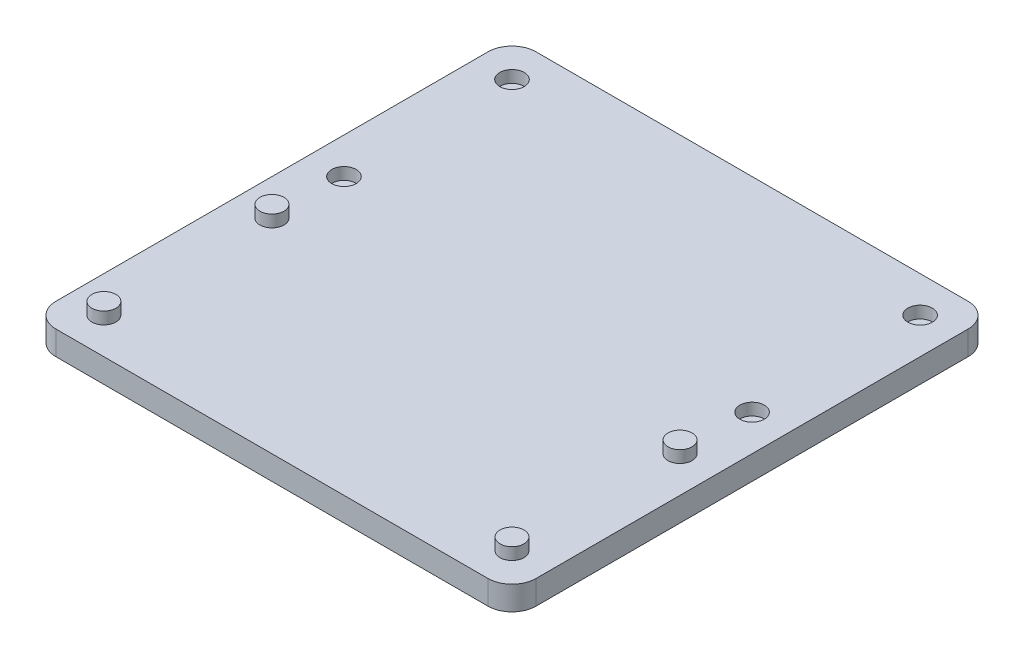
ISO-10303-21;
HEADER;
FILE_DESCRIPTION(('STEP AP214'),'2;1');
FILE_NAME('part.step','',(''),(''),'','','');
FILE_SCHEMA(('AUTOMOTIVE_DESIGN { 1 0 10303 214 1 1 1 1 }'));
ENDSEC;
DATA;
#1=APPLICATION_CONTEXT('core data for automotive mechanical design processes');
#2=APPLICATION_PROTOCOL_DEFINITION('international standard','automotive_design',2000,#1);
#3=PRODUCT_CONTEXT('',#1,'mechanical');
#4=PRODUCT('Part','Part','',(#3));
#5=PRODUCT_RELATED_PRODUCT_CATEGORY('part','',(#4));
#6=PRODUCT_DEFINITION_FORMATION('','',#4);
#7=PRODUCT_DEFINITION_CONTEXT('part definition',#1,'design');
#8=PRODUCT_DEFINITION('design','',#6,#7);
#9=PRODUCT_DEFINITION_SHAPE('','',#8);
#10=(LENGTH_UNIT() NAMED_UNIT(*) SI_UNIT(.MILLI.,.METRE.));
#11=(NAMED_UNIT(*) PLANE_ANGLE_UNIT() SI_UNIT($,.RADIAN.));
#12=(NAMED_UNIT(*) SI_UNIT($,.STERADIAN.) SOLID_ANGLE_UNIT());
#13=UNCERTAINTY_MEASURE_WITH_UNIT(LENGTH_MEASURE(1.E-05),#10,'distance_accuracy_value','');
#14=(GEOMETRIC_REPRESENTATION_CONTEXT(3) GLOBAL_UNCERTAINTY_ASSIGNED_CONTEXT((#13)) GLOBAL_UNIT_ASSIGNED_CONTEXT((#10,
#11,#12)) REPRESENTATION_CONTEXT('',''));
#15=CARTESIAN_POINT('',(0.,0.,0.));
#16=DIRECTION('',(0.,0.,1.));
#17=DIRECTION('',(1.,0.,0.));
#18=AXIS2_PLACEMENT_3D('',#15,#16,#17);
#19=CARTESIAN_POINT('',(100.,10.,100.));
#20=DIRECTION('',(-1.,0.,0.));
#21=DIRECTION('',(0.,0.,1.));
#22=AXIS2_PLACEMENT_3D('',#19,#20,#21);
#23=PLANE('',#22);
#24=DIRECTION('',(0.,0.,-1.));
#25=VECTOR('',#24,1.);
#26=CARTESIAN_POINT('',(100.,0.,100.));
#27=LINE('',#26,#25);
#28=CARTESIAN_POINT('',(100.,0.,90.));
#29=VERTEX_POINT('',#28);
#30=CARTESIAN_POINT('',(100.,0.,-90.));
#31=VERTEX_POINT('',#30);
#32=EDGE_CURVE('E126',#29,#31,#27,.T.);
#33=ORIENTED_EDGE('',*,*,#32,.T.);
#34=DIRECTION('',(0.,-1.,0.));
#35=VECTOR('',#34,1.);
#36=CARTESIAN_POINT('',(100.,10.,-90.));
#37=LINE('',#36,#35);
#38=CARTESIAN_POINT('',(100.,10.,-90.));
#39=VERTEX_POINT('',#38);
#40=EDGE_CURVE('E104',#31,#39,#37,.F.);
#41=ORIENTED_EDGE('',*,*,#40,.T.);
#42=DIRECTION('',(0.,0.,-1.));
#43=VECTOR('',#42,1.);
#44=CARTESIAN_POINT('',(100.,10.,100.));
#45=LINE('',#44,#43);
#46=CARTESIAN_POINT('',(100.,10.,90.));
#47=VERTEX_POINT('',#46);
#48=EDGE_CURVE('E136',#47,#39,#45,.T.);
#49=ORIENTED_EDGE('',*,*,#48,.F.);
#50=DIRECTION('',(0.,-1.,0.));
#51=VECTOR('',#50,1.);
#52=CARTESIAN_POINT('',(100.,10.,90.));
#53=LINE('',#52,#51);
#54=EDGE_CURVE('E109',#47,#29,#53,.T.);
#55=ORIENTED_EDGE('',*,*,#54,.T.);
#56=EDGE_LOOP('',(#33,#41,#49,#55));
#57=FACE_BOUND('',#56,.T.);
#58=ADVANCED_FACE('F33',(#57),#23,.F.);
#59=CARTESIAN_POINT('',(-100.,10.,-100.));
#60=DIRECTION('',(0.,0.,1.));
#61=DIRECTION('',(1.,0.,0.));
#62=AXIS2_PLACEMENT_3D('',#59,#60,#61);
#63=PLANE('',#62);
#64=DIRECTION('',(-1.,0.,0.));
#65=VECTOR('',#64,1.);
#66=CARTESIAN_POINT('',(-100.,10.,-100.));
#67=LINE('',#66,#65);
#68=CARTESIAN_POINT('',(90.,10.,-100.));
#69=VERTEX_POINT('',#68);
#70=CARTESIAN_POINT('',(-90.,10.,-100.));
#71=VERTEX_POINT('',#70);
#72=EDGE_CURVE('E119',#69,#71,#67,.T.);
#73=ORIENTED_EDGE('',*,*,#72,.F.);
#74=DIRECTION('',(0.,-1.,0.));
#75=VECTOR('',#74,1.);
#76=CARTESIAN_POINT('',(90.,10.,-100.));
#77=LINE('',#76,#75);
#78=CARTESIAN_POINT('',(90.,0.,-100.));
#79=VERTEX_POINT('',#78);
#80=EDGE_CURVE('E103',#69,#79,#77,.T.);
#81=ORIENTED_EDGE('',*,*,#80,.T.);
#82=DIRECTION('',(-1.,0.,0.));
#83=VECTOR('',#82,1.);
#84=CARTESIAN_POINT('',(-100.,0.,-100.));
#85=LINE('',#84,#83);
#86=CARTESIAN_POINT('',(-90.,0.,-100.));
#87=VERTEX_POINT('',#86);
#88=EDGE_CURVE('E116',#79,#87,#85,.T.);
#89=ORIENTED_EDGE('',*,*,#88,.T.);
#90=DIRECTION('',(0.,-1.,0.));
#91=VECTOR('',#90,1.);
#92=CARTESIAN_POINT('',(-90.,10.,-100.));
#93=LINE('',#92,#91);
#94=EDGE_CURVE('E121',#87,#71,#93,.F.);
#95=ORIENTED_EDGE('',*,*,#94,.T.);
#96=EDGE_LOOP('',(#73,#81,#89,#95));
#97=FACE_BOUND('',#96,.T.);
#98=ADVANCED_FACE('F115',(#97),#63,.F.);
#99=CARTESIAN_POINT('',(-100.,10.,100.));
#100=DIRECTION('',(1.,0.,0.));
#101=DIRECTION('',(0.,0.,-1.));
#102=AXIS2_PLACEMENT_3D('',#99,#100,#101);
#103=PLANE('',#102);
#104=DIRECTION('',(0.,0.,1.));
#105=VECTOR('',#104,1.);
#106=CARTESIAN_POINT('',(-100.,0.,100.));
#107=LINE('',#106,#105);
#108=CARTESIAN_POINT('',(-100.,0.,-90.));
#109=VERTEX_POINT('',#108);
#110=CARTESIAN_POINT('',(-100.,0.,90.));
#111=VERTEX_POINT('',#110);
#112=EDGE_CURVE('E125',#109,#111,#107,.T.);
#113=ORIENTED_EDGE('',*,*,#112,.T.);
#114=DIRECTION('',(0.,-1.,0.));
#115=VECTOR('',#114,1.);
#116=CARTESIAN_POINT('',(-100.,10.,90.));
#117=LINE('',#116,#115);
#118=CARTESIAN_POINT('',(-100.,10.,90.));
#119=VERTEX_POINT('',#118);
#120=EDGE_CURVE('E11',#111,#119,#117,.F.);
#121=ORIENTED_EDGE('',*,*,#120,.T.);
#122=DIRECTION('',(0.,0.,1.));
#123=VECTOR('',#122,1.);
#124=CARTESIAN_POINT('',(-100.,10.,100.));
#125=LINE('',#124,#123);
#126=CARTESIAN_POINT('',(-100.,10.,-90.));
#127=VERTEX_POINT('',#126);
#128=EDGE_CURVE('E174',#127,#119,#125,.T.);
#129=ORIENTED_EDGE('',*,*,#128,.F.);
#130=DIRECTION('',(0.,-1.,0.));
#131=VECTOR('',#130,1.);
#132=CARTESIAN_POINT('',(-100.,10.,-90.));
#133=LINE('',#132,#131);
#134=EDGE_CURVE('E41',#127,#109,#133,.T.);
#135=ORIENTED_EDGE('',*,*,#134,.T.);
#136=EDGE_LOOP('',(#113,#121,#129,#135));
#137=FACE_BOUND('',#136,.T.);
#138=ADVANCED_FACE('F172',(#137),#103,.F.);
#139=CARTESIAN_POINT('',(-100.,10.,100.));
#140=DIRECTION('',(0.,0.,-1.));
#141=DIRECTION('',(-1.,0.,0.));
#142=AXIS2_PLACEMENT_3D('',#139,#140,#141);
#143=PLANE('',#142);
#144=DIRECTION('',(1.,0.,0.));
#145=VECTOR('',#144,1.);
#146=CARTESIAN_POINT('',(-100.,0.,100.));
#147=LINE('',#146,#145);
#148=CARTESIAN_POINT('',(-90.,0.,100.));
#149=VERTEX_POINT('',#148);
#150=CARTESIAN_POINT('',(90.,0.,100.));
#151=VERTEX_POINT('',#150);
#152=EDGE_CURVE('E129',#149,#151,#147,.T.);
#153=ORIENTED_EDGE('',*,*,#152,.T.);
#154=DIRECTION('',(0.,-1.,0.));
#155=VECTOR('',#154,1.);
#156=CARTESIAN_POINT('',(90.,10.,100.));
#157=LINE('',#156,#155);
#158=CARTESIAN_POINT('',(90.,10.,100.));
#159=VERTEX_POINT('',#158);
#160=EDGE_CURVE('E48',#151,#159,#157,.F.);
#161=ORIENTED_EDGE('',*,*,#160,.T.);
#162=DIRECTION('',(1.,0.,0.));
#163=VECTOR('',#162,1.);
#164=CARTESIAN_POINT('',(-100.,10.,100.));
#165=LINE('',#164,#163);
#166=CARTESIAN_POINT('',(-90.,10.,100.));
#167=VERTEX_POINT('',#166);
#168=EDGE_CURVE('E141',#167,#159,#165,.T.);
#169=ORIENTED_EDGE('',*,*,#168,.F.);
#170=DIRECTION('',(0.,-1.,0.));
#171=VECTOR('',#170,1.);
#172=CARTESIAN_POINT('',(-90.,10.,100.));
#173=LINE('',#172,#171);
#174=EDGE_CURVE('E165',#167,#149,#173,.T.);
#175=ORIENTED_EDGE('',*,*,#174,.T.);
#176=EDGE_LOOP('',(#153,#161,#169,#175));
#177=FACE_BOUND('',#176,.T.);
#178=ADVANCED_FACE('F181',(#177),#143,.F.);
#179=CARTESIAN_POINT('',(0.,10.,0.));
#180=DIRECTION('',(0.,-1.,0.));
#181=DIRECTION('',(0.,0.,-1.));
#182=AXIS2_PLACEMENT_3D('',#179,#180,#181);
#183=PLANE('',#182);
#184=CARTESIAN_POINT('',(85.,10.,-85.));
#185=DIRECTION('',(0.,1.,0.));
#186=DIRECTION('',(0.,0.,1.));
#187=AXIS2_PLACEMENT_3D('',#184,#185,#186);
#188=CIRCLE('',#187,5.1);
#189=CARTESIAN_POINT('',(85.,10.,-79.9));
#190=VERTEX_POINT('',#189);
#191=EDGE_CURVE('E213',#190,#190,#188,.T.);
#192=ORIENTED_EDGE('',*,*,#191,.F.);
#193=EDGE_LOOP('',(#192));
#194=FACE_BOUND('',#193,.T.);
#195=CARTESIAN_POINT('',(-85.,10.,-15.));
#196=DIRECTION('',(0.,1.,0.));
#197=DIRECTION('',(0.,0.,1.));
#198=AXIS2_PLACEMENT_3D('',#195,#196,#197);
#199=CIRCLE('',#198,5.1);
#200=CARTESIAN_POINT('',(-85.,10.,-9.9));
#201=VERTEX_POINT('',#200);
#202=EDGE_CURVE('E206',#201,#201,#199,.T.);
#203=ORIENTED_EDGE('',*,*,#202,.F.);
#204=EDGE_LOOP('',(#203));
#205=FACE_BOUND('',#204,.T.);
#206=CARTESIAN_POINT('',(85.,10.,-15.));
#207=DIRECTION('',(0.,1.,0.));
#208=DIRECTION('',(0.,0.,1.));
#209=AXIS2_PLACEMENT_3D('',#206,#207,#208);
#210=CIRCLE('',#209,5.1);
#211=CARTESIAN_POINT('',(85.,10.,-9.9));
#212=VERTEX_POINT('',#211);
#213=EDGE_CURVE('E218',#212,#212,#210,.T.);
#214=ORIENTED_EDGE('',*,*,#213,.F.);
#215=EDGE_LOOP('',(#214));
#216=FACE_BOUND('',#215,.T.);
#217=CARTESIAN_POINT('',(-85.,10.,-85.));
#218=DIRECTION('',(0.,1.,0.));
#219=DIRECTION('',(0.,0.,1.));
#220=AXIS2_PLACEMENT_3D('',#217,#218,#219);
#221=CIRCLE('',#220,5.1);
#222=CARTESIAN_POINT('',(-85.,10.,-79.9));
#223=VERTEX_POINT('',#222);
#224=EDGE_CURVE('E200',#223,#223,#221,.T.);
#225=ORIENTED_EDGE('',*,*,#224,.F.);
#226=EDGE_LOOP('',(#225));
#227=FACE_BOUND('',#226,.T.);
#228=CARTESIAN_POINT('',(85.,10.,15.));
#229=DIRECTION('',(0.,-1.,0.));
#230=DIRECTION('',(0.,0.,-1.));
#231=AXIS2_PLACEMENT_3D('',#228,#229,#230);
#232=CIRCLE('',#231,5.);
#233=CARTESIAN_POINT('',(85.,10.,9.99999999999999));
#234=VERTEX_POINT('',#233);
#235=EDGE_CURVE('E147',#234,#234,#232,.F.);
#236=ORIENTED_EDGE('',*,*,#235,.F.);
#237=EDGE_LOOP('',(#236));
#238=FACE_BOUND('',#237,.T.);
#239=CARTESIAN_POINT('',(85.,10.,85.));
#240=DIRECTION('',(0.,-1.,0.));
#241=DIRECTION('',(0.,0.,-1.));
#242=AXIS2_PLACEMENT_3D('',#239,#240,#241);
#243=CIRCLE('',#242,5.00000000000001);
#244=CARTESIAN_POINT('',(85.,10.,80.));
#245=VERTEX_POINT('',#244);
#246=EDGE_CURVE('E144',#245,#245,#243,.F.);
#247=ORIENTED_EDGE('',*,*,#246,.F.);
#248=EDGE_LOOP('',(#247));
#249=FACE_BOUND('',#248,.T.);
#250=CARTESIAN_POINT('',(-85.,10.,85.));
#251=DIRECTION('',(0.,-1.,0.));
#252=DIRECTION('',(0.,0.,-1.));
#253=AXIS2_PLACEMENT_3D('',#250,#251,#252);
#254=CIRCLE('',#253,5.00000000000001);
#255=CARTESIAN_POINT('',(-85.,10.,80.));
#256=VERTEX_POINT('',#255);
#257=EDGE_CURVE('E140',#256,#256,#254,.F.);
#258=ORIENTED_EDGE('',*,*,#257,.F.);
#259=EDGE_LOOP('',(#258));
#260=FACE_BOUND('',#259,.T.);
#261=CARTESIAN_POINT('',(-85.,10.,15.));
#262=DIRECTION('',(0.,-1.,0.));
#263=DIRECTION('',(0.,0.,-1.));
#264=AXIS2_PLACEMENT_3D('',#261,#262,#263);
#265=CIRCLE('',#264,5.);
#266=CARTESIAN_POINT('',(-85.,10.,9.99999999999999));
#267=VERTEX_POINT('',#266);
#268=EDGE_CURVE('E137',#267,#267,#265,.F.);
#269=ORIENTED_EDGE('',*,*,#268,.F.);
#270=EDGE_LOOP('',(#269));
#271=FACE_BOUND('',#270,.T.);
#272=ORIENTED_EDGE('',*,*,#48,.T.);
#273=CARTESIAN_POINT('',(90.,10.,-90.));
#274=DIRECTION('',(0.,-1.,0.));
#275=DIRECTION('',(0.,0.,-1.));
#276=AXIS2_PLACEMENT_3D('',#273,#274,#275);
#277=CIRCLE('',#276,10.);
#278=EDGE_CURVE('E163',#39,#69,#277,.F.);
#279=ORIENTED_EDGE('',*,*,#278,.T.);
#280=ORIENTED_EDGE('',*,*,#72,.T.);
#281=CARTESIAN_POINT('',(-90.,10.,-90.));
#282=DIRECTION('',(0.,-1.,0.));
#283=DIRECTION('',(0.,0.,-1.));
#284=AXIS2_PLACEMENT_3D('',#281,#282,#283);
#285=CIRCLE('',#284,10.);
#286=EDGE_CURVE('E158',#71,#127,#285,.F.);
#287=ORIENTED_EDGE('',*,*,#286,.T.);
#288=ORIENTED_EDGE('',*,*,#128,.T.);
#289=CARTESIAN_POINT('',(-90.,10.,90.));
#290=DIRECTION('',(0.,-1.,0.));
#291=DIRECTION('',(0.,0.,-1.));
#292=AXIS2_PLACEMENT_3D('',#289,#290,#291);
#293=CIRCLE('',#292,10.);
#294=EDGE_CURVE('E55',#119,#167,#293,.F.);
#295=ORIENTED_EDGE('',*,*,#294,.T.);
#296=ORIENTED_EDGE('',*,*,#168,.T.);
#297=CARTESIAN_POINT('',(90.,10.,90.));
#298=DIRECTION('',(0.,-1.,0.));
#299=DIRECTION('',(0.,0.,-1.));
#300=AXIS2_PLACEMENT_3D('',#297,#298,#299);
#301=CIRCLE('',#300,10.);
#302=EDGE_CURVE('E161',#159,#47,#301,.F.);
#303=ORIENTED_EDGE('',*,*,#302,.T.);
#304=EDGE_LOOP('',(#272,#279,#280,#287,#288,#295,#296,#303));
#305=FACE_BOUND('',#304,.T.);
#306=ADVANCED_FACE('F233',(#194,#205,#216,#227,#238,#249,#260,#271,#305),#183,.F.);
#307=CARTESIAN_POINT('',(0.,0.,0.));
#308=DIRECTION('',(0.,-1.,0.));
#309=DIRECTION('',(0.,0.,-1.));
#310=AXIS2_PLACEMENT_3D('',#307,#308,#309);
#311=PLANE('',#310);
#312=ORIENTED_EDGE('',*,*,#88,.F.);
#313=CARTESIAN_POINT('',(90.,0.,-90.));
#314=DIRECTION('',(0.,-1.,0.));
#315=DIRECTION('',(0.,0.,-1.));
#316=AXIS2_PLACEMENT_3D('',#313,#314,#315);
#317=CIRCLE('',#316,10.);
#318=EDGE_CURVE('E99',#79,#31,#317,.T.);
#319=ORIENTED_EDGE('',*,*,#318,.T.);
#320=ORIENTED_EDGE('',*,*,#32,.F.);
#321=CARTESIAN_POINT('',(90.,0.,90.));
#322=DIRECTION('',(0.,-1.,0.));
#323=DIRECTION('',(0.,0.,-1.));
#324=AXIS2_PLACEMENT_3D('',#321,#322,#323);
#325=CIRCLE('',#324,10.);
#326=EDGE_CURVE('E110',#29,#151,#325,.T.);
#327=ORIENTED_EDGE('',*,*,#326,.T.);
#328=ORIENTED_EDGE('',*,*,#152,.F.);
#329=CARTESIAN_POINT('',(-90.,0.,90.));
#330=DIRECTION('',(0.,-1.,0.));
#331=DIRECTION('',(0.,0.,-1.));
#332=AXIS2_PLACEMENT_3D('',#329,#330,#331);
#333=CIRCLE('',#332,10.);
#334=EDGE_CURVE('E152',#149,#111,#333,.T.);
#335=ORIENTED_EDGE('',*,*,#334,.T.);
#336=ORIENTED_EDGE('',*,*,#112,.F.);
#337=CARTESIAN_POINT('',(-90.,0.,-90.));
#338=DIRECTION('',(0.,-1.,0.));
#339=DIRECTION('',(0.,0.,-1.));
#340=AXIS2_PLACEMENT_3D('',#337,#338,#339);
#341=CIRCLE('',#340,10.);
#342=EDGE_CURVE('E120',#109,#87,#341,.T.);
#343=ORIENTED_EDGE('',*,*,#342,.T.);
#344=EDGE_LOOP('',(#312,#319,#320,#327,#328,#335,#336,#343));
#345=FACE_BOUND('',#344,.T.);
#346=ADVANCED_FACE('F123',(#345),#311,.T.);
#347=CARTESIAN_POINT('',(-85.,15.,15.));
#348=DIRECTION('',(0.,-1.,0.));
#349=DIRECTION('',(0.,0.,-1.));
#350=AXIS2_PLACEMENT_3D('',#347,#348,#349);
#351=CYLINDRICAL_SURFACE('',#350,5.);
#352=CARTESIAN_POINT('',(-85.,15.,15.));
#353=DIRECTION('',(0.,1.,0.));
#354=DIRECTION('',(0.,0.,1.));
#355=AXIS2_PLACEMENT_3D('',#352,#353,#354);
#356=CIRCLE('',#355,5.);
#357=CARTESIAN_POINT('',(-85.,15.,20.));
#358=VERTEX_POINT('',#357);
#359=EDGE_CURVE('E131',#358,#358,#356,.T.);
#360=ORIENTED_EDGE('',*,*,#359,.F.);
#361=EDGE_LOOP('',(#360));
#362=FACE_BOUND('',#361,.T.);
#363=ORIENTED_EDGE('',*,*,#268,.T.);
#364=EDGE_LOOP('',(#363));
#365=FACE_BOUND('',#364,.T.);
#366=ADVANCED_FACE('F272',(#362,#365),#351,.T.);
#367=CARTESIAN_POINT('',(-85.,15.,15.));
#368=DIRECTION('',(0.,1.,0.));
#369=DIRECTION('',(0.,0.,1.));
#370=AXIS2_PLACEMENT_3D('',#367,#368,#369);
#371=PLANE('',#370);
#372=ORIENTED_EDGE('',*,*,#359,.T.);
#373=EDGE_LOOP('',(#372));
#374=FACE_BOUND('',#373,.T.);
#375=ADVANCED_FACE('F276',(#374),#371,.T.);
#376=CARTESIAN_POINT('',(-85.,15.,85.));
#377=DIRECTION('',(0.,-1.,0.));
#378=DIRECTION('',(0.,0.,-1.));
#379=AXIS2_PLACEMENT_3D('',#376,#377,#378);
#380=CYLINDRICAL_SURFACE('',#379,5.00000000000001);
#381=CARTESIAN_POINT('',(-85.,15.,85.));
#382=DIRECTION('',(0.,1.,0.));
#383=DIRECTION('',(0.,0.,1.));
#384=AXIS2_PLACEMENT_3D('',#381,#382,#383);
#385=CIRCLE('',#384,5.00000000000001);
#386=CARTESIAN_POINT('',(-85.,15.,90.));
#387=VERTEX_POINT('',#386);
#388=EDGE_CURVE('E190',#387,#387,#385,.T.);
#389=ORIENTED_EDGE('',*,*,#388,.F.);
#390=EDGE_LOOP('',(#389));
#391=FACE_BOUND('',#390,.T.);
#392=ORIENTED_EDGE('',*,*,#257,.T.);
#393=EDGE_LOOP('',(#392));
#394=FACE_BOUND('',#393,.T.);
#395=ADVANCED_FACE('F280',(#391,#394),#380,.T.);
#396=CARTESIAN_POINT('',(-85.,15.,85.));
#397=DIRECTION('',(0.,1.,0.));
#398=DIRECTION('',(0.,0.,1.));
#399=AXIS2_PLACEMENT_3D('',#396,#397,#398);
#400=PLANE('',#399);
#401=ORIENTED_EDGE('',*,*,#388,.T.);
#402=EDGE_LOOP('',(#401));
#403=FACE_BOUND('',#402,.T.);
#404=ADVANCED_FACE('F284',(#403),#400,.T.);
#405=CARTESIAN_POINT('',(85.,15.,85.));
#406=DIRECTION('',(0.,-1.,0.));
#407=DIRECTION('',(0.,0.,-1.));
#408=AXIS2_PLACEMENT_3D('',#405,#406,#407);
#409=CYLINDRICAL_SURFACE('',#408,5.00000000000001);
#410=CARTESIAN_POINT('',(85.,15.,85.));
#411=DIRECTION('',(0.,1.,0.));
#412=DIRECTION('',(0.,0.,1.));
#413=AXIS2_PLACEMENT_3D('',#410,#411,#412);
#414=CIRCLE('',#413,5.00000000000001);
#415=CARTESIAN_POINT('',(85.,15.,90.));
#416=VERTEX_POINT('',#415);
#417=EDGE_CURVE('E193',#416,#416,#414,.T.);
#418=ORIENTED_EDGE('',*,*,#417,.F.);
#419=EDGE_LOOP('',(#418));
#420=FACE_BOUND('',#419,.T.);
#421=ORIENTED_EDGE('',*,*,#246,.T.);
#422=EDGE_LOOP('',(#421));
#423=FACE_BOUND('',#422,.T.);
#424=ADVANCED_FACE('F288',(#420,#423),#409,.T.);
#425=CARTESIAN_POINT('',(85.,15.,85.));
#426=DIRECTION('',(0.,1.,0.));
#427=DIRECTION('',(0.,0.,1.));
#428=AXIS2_PLACEMENT_3D('',#425,#426,#427);
#429=PLANE('',#428);
#430=ORIENTED_EDGE('',*,*,#417,.T.);
#431=EDGE_LOOP('',(#430));
#432=FACE_BOUND('',#431,.T.);
#433=ADVANCED_FACE('F292',(#432),#429,.T.);
#434=CARTESIAN_POINT('',(85.,15.,15.));
#435=DIRECTION('',(0.,-1.,0.));
#436=DIRECTION('',(0.,0.,-1.));
#437=AXIS2_PLACEMENT_3D('',#434,#435,#436);
#438=CYLINDRICAL_SURFACE('',#437,5.);
#439=CARTESIAN_POINT('',(85.,15.,15.));
#440=DIRECTION('',(0.,1.,0.));
#441=DIRECTION('',(0.,0.,1.));
#442=AXIS2_PLACEMENT_3D('',#439,#440,#441);
#443=CIRCLE('',#442,5.);
#444=CARTESIAN_POINT('',(85.,15.,20.));
#445=VERTEX_POINT('',#444);
#446=EDGE_CURVE('E196',#445,#445,#443,.T.);
#447=ORIENTED_EDGE('',*,*,#446,.F.);
#448=EDGE_LOOP('',(#447));
#449=FACE_BOUND('',#448,.T.);
#450=ORIENTED_EDGE('',*,*,#235,.T.);
#451=EDGE_LOOP('',(#450));
#452=FACE_BOUND('',#451,.T.);
#453=ADVANCED_FACE('F296',(#449,#452),#438,.T.);
#454=CARTESIAN_POINT('',(85.,15.,15.));
#455=DIRECTION('',(0.,1.,0.));
#456=DIRECTION('',(0.,0.,1.));
#457=AXIS2_PLACEMENT_3D('',#454,#455,#456);
#458=PLANE('',#457);
#459=ORIENTED_EDGE('',*,*,#446,.T.);
#460=EDGE_LOOP('',(#459));
#461=FACE_BOUND('',#460,.T.);
#462=ADVANCED_FACE('F258',(#461),#458,.T.);
#463=CARTESIAN_POINT('',(90.,10.,-90.));
#464=DIRECTION('',(0.,-1.,0.));
#465=DIRECTION('',(0.,0.,-1.));
#466=AXIS2_PLACEMENT_3D('',#463,#464,#465);
#467=CYLINDRICAL_SURFACE('',#466,10.);
#468=ORIENTED_EDGE('',*,*,#278,.F.);
#469=ORIENTED_EDGE('',*,*,#40,.F.);
#470=ORIENTED_EDGE('',*,*,#318,.F.);
#471=ORIENTED_EDGE('',*,*,#80,.F.);
#472=EDGE_LOOP('',(#468,#469,#470,#471));
#473=FACE_BOUND('',#472,.T.);
#474=ADVANCED_FACE('F102',(#473),#467,.T.);
#475=CARTESIAN_POINT('',(90.,10.,90.));
#476=DIRECTION('',(0.,-1.,0.));
#477=DIRECTION('',(0.,0.,-1.));
#478=AXIS2_PLACEMENT_3D('',#475,#476,#477);
#479=CYLINDRICAL_SURFACE('',#478,10.);
#480=ORIENTED_EDGE('',*,*,#302,.F.);
#481=ORIENTED_EDGE('',*,*,#160,.F.);
#482=ORIENTED_EDGE('',*,*,#326,.F.);
#483=ORIENTED_EDGE('',*,*,#54,.F.);
#484=EDGE_LOOP('',(#480,#481,#482,#483));
#485=FACE_BOUND('',#484,.T.);
#486=ADVANCED_FACE('F251',(#485),#479,.T.);
#487=CARTESIAN_POINT('',(-90.,10.,90.));
#488=DIRECTION('',(0.,-1.,0.));
#489=DIRECTION('',(0.,0.,-1.));
#490=AXIS2_PLACEMENT_3D('',#487,#488,#489);
#491=CYLINDRICAL_SURFACE('',#490,10.);
#492=ORIENTED_EDGE('',*,*,#294,.F.);
#493=ORIENTED_EDGE('',*,*,#120,.F.);
#494=ORIENTED_EDGE('',*,*,#334,.F.);
#495=ORIENTED_EDGE('',*,*,#174,.F.);
#496=EDGE_LOOP('',(#492,#493,#494,#495));
#497=FACE_BOUND('',#496,.T.);
#498=ADVANCED_FACE('F180',(#497),#491,.T.);
#499=CARTESIAN_POINT('',(-90.,10.,-90.));
#500=DIRECTION('',(0.,-1.,0.));
#501=DIRECTION('',(0.,0.,-1.));
#502=AXIS2_PLACEMENT_3D('',#499,#500,#501);
#503=CYLINDRICAL_SURFACE('',#502,10.);
#504=ORIENTED_EDGE('',*,*,#286,.F.);
#505=ORIENTED_EDGE('',*,*,#94,.F.);
#506=ORIENTED_EDGE('',*,*,#342,.F.);
#507=ORIENTED_EDGE('',*,*,#134,.F.);
#508=EDGE_LOOP('',(#504,#505,#506,#507));
#509=FACE_BOUND('',#508,.T.);
#510=ADVANCED_FACE('F35',(#509),#503,.T.);
#511=CARTESIAN_POINT('',(-85.,5.,-85.));
#512=DIRECTION('',(0.,1.,0.));
#513=DIRECTION('',(0.,0.,1.));
#514=AXIS2_PLACEMENT_3D('',#511,#512,#513);
#515=CYLINDRICAL_SURFACE('',#514,5.1);
#516=CARTESIAN_POINT('',(-85.,5.,-85.));
#517=DIRECTION('',(0.,1.,0.));
#518=DIRECTION('',(0.,0.,1.));
#519=AXIS2_PLACEMENT_3D('',#516,#517,#518);
#520=CIRCLE('',#519,5.1);
#521=CARTESIAN_POINT('',(-85.,5.,-79.9));
#522=VERTEX_POINT('',#521);
#523=EDGE_CURVE('E199',#522,#522,#520,.T.);
#524=ORIENTED_EDGE('',*,*,#523,.F.);
#525=EDGE_LOOP('',(#524));
#526=FACE_BOUND('',#525,.T.);
#527=ORIENTED_EDGE('',*,*,#224,.T.);
#528=EDGE_LOOP('',(#527));
#529=FACE_BOUND('',#528,.T.);
#530=ADVANCED_FACE('F304',(#526,#529),#515,.F.);
#531=CARTESIAN_POINT('',(-85.,5.,-85.));
#532=DIRECTION('',(0.,1.,0.));
#533=DIRECTION('',(0.,0.,1.));
#534=AXIS2_PLACEMENT_3D('',#531,#532,#533);
#535=PLANE('',#534);
#536=ORIENTED_EDGE('',*,*,#523,.T.);
#537=EDGE_LOOP('',(#536));
#538=FACE_BOUND('',#537,.T.);
#539=ADVANCED_FACE('F229',(#538),#535,.T.);
#540=CARTESIAN_POINT('',(85.,5.,-15.));
#541=DIRECTION('',(0.,1.,0.));
#542=DIRECTION('',(0.,0.,1.));
#543=AXIS2_PLACEMENT_3D('',#540,#541,#542);
#544=CYLINDRICAL_SURFACE('',#543,5.1);
#545=CARTESIAN_POINT('',(85.,5.,-15.));
#546=DIRECTION('',(0.,1.,0.));
#547=DIRECTION('',(0.,0.,1.));
#548=AXIS2_PLACEMENT_3D('',#545,#546,#547);
#549=CIRCLE('',#548,5.1);
#550=CARTESIAN_POINT('',(85.,5.,-9.9));
#551=VERTEX_POINT('',#550);
#552=EDGE_CURVE('E210',#551,#551,#549,.T.);
#553=ORIENTED_EDGE('',*,*,#552,.F.);
#554=EDGE_LOOP('',(#553));
#555=FACE_BOUND('',#554,.T.);
#556=ORIENTED_EDGE('',*,*,#213,.T.);
#557=EDGE_LOOP('',(#556));
#558=FACE_BOUND('',#557,.T.);
#559=ADVANCED_FACE('F226',(#555,#558),#544,.F.);
#560=CARTESIAN_POINT('',(85.,5.,-15.));
#561=DIRECTION('',(0.,1.,0.));
#562=DIRECTION('',(0.,0.,1.));
#563=AXIS2_PLACEMENT_3D('',#560,#561,#562);
#564=PLANE('',#563);
#565=ORIENTED_EDGE('',*,*,#552,.T.);
#566=EDGE_LOOP('',(#565));
#567=FACE_BOUND('',#566,.T.);
#568=ADVANCED_FACE('F224',(#567),#564,.T.);
#569=CARTESIAN_POINT('',(-85.,5.,-15.));
#570=DIRECTION('',(0.,1.,0.));
#571=DIRECTION('',(0.,0.,1.));
#572=AXIS2_PLACEMENT_3D('',#569,#570,#571);
#573=CYLINDRICAL_SURFACE('',#572,5.1);
#574=CARTESIAN_POINT('',(-85.,5.,-15.));
#575=DIRECTION('',(0.,1.,0.));
#576=DIRECTION('',(0.,0.,1.));
#577=AXIS2_PLACEMENT_3D('',#574,#575,#576);
#578=CIRCLE('',#577,5.1);
#579=CARTESIAN_POINT('',(-85.,5.,-9.9));
#580=VERTEX_POINT('',#579);
#581=EDGE_CURVE('E209',#580,#580,#578,.T.);
#582=ORIENTED_EDGE('',*,*,#581,.F.);
#583=EDGE_LOOP('',(#582));
#584=FACE_BOUND('',#583,.T.);
#585=ORIENTED_EDGE('',*,*,#202,.T.);
#586=EDGE_LOOP('',(#585));
#587=FACE_BOUND('',#586,.T.);
#588=ADVANCED_FACE('F311',(#584,#587),#573,.F.);
#589=CARTESIAN_POINT('',(-85.,5.,-15.));
#590=DIRECTION('',(0.,1.,0.));
#591=DIRECTION('',(0.,0.,1.));
#592=AXIS2_PLACEMENT_3D('',#589,#590,#591);
#593=PLANE('',#592);
#594=ORIENTED_EDGE('',*,*,#581,.T.);
#595=EDGE_LOOP('',(#594));
#596=FACE_BOUND('',#595,.T.);
#597=ADVANCED_FACE('F314',(#596),#593,.T.);
#598=CARTESIAN_POINT('',(85.,5.,-85.));
#599=DIRECTION('',(0.,1.,0.));
#600=DIRECTION('',(0.,0.,1.));
#601=AXIS2_PLACEMENT_3D('',#598,#599,#600);
#602=CYLINDRICAL_SURFACE('',#601,5.1);
#603=CARTESIAN_POINT('',(85.,5.,-85.));
#604=DIRECTION('',(0.,1.,0.));
#605=DIRECTION('',(0.,0.,1.));
#606=AXIS2_PLACEMENT_3D('',#603,#604,#605);
#607=CIRCLE('',#606,5.1);
#608=CARTESIAN_POINT('',(85.,5.,-79.9));
#609=VERTEX_POINT('',#608);
#610=EDGE_CURVE('E203',#609,#609,#607,.T.);
#611=ORIENTED_EDGE('',*,*,#610,.F.);
#612=EDGE_LOOP('',(#611));
#613=FACE_BOUND('',#612,.T.);
#614=ORIENTED_EDGE('',*,*,#191,.T.);
#615=EDGE_LOOP('',(#614));
#616=FACE_BOUND('',#615,.T.);
#617=ADVANCED_FACE('F318',(#613,#616),#602,.F.);
#618=CARTESIAN_POINT('',(85.,5.,-85.));
#619=DIRECTION('',(0.,1.,0.));
#620=DIRECTION('',(0.,0.,1.));
#621=AXIS2_PLACEMENT_3D('',#618,#619,#620);
#622=PLANE('',#621);
#623=ORIENTED_EDGE('',*,*,#610,.T.);
#624=EDGE_LOOP('',(#623));
#625=FACE_BOUND('',#624,.T.);
#626=ADVANCED_FACE('F322',(#625),#622,.T.);
#627=CLOSED_SHELL('',(#58,#98,#138,#178,#306,#346,#366,#375,#395,#404,#424,#433,#453,#462,#474,
#486,#498,#510,#530,#539,#559,#568,#588,#597,#617,#626));
#628=MANIFOLD_SOLID_BREP('B2',#627);
#629=ADVANCED_BREP_SHAPE_REPRESENTATION('',(#18,#628),#14);
#630=SHAPE_DEFINITION_REPRESENTATION(#9,#629);
ENDSEC;
END-ISO-10303-21;
